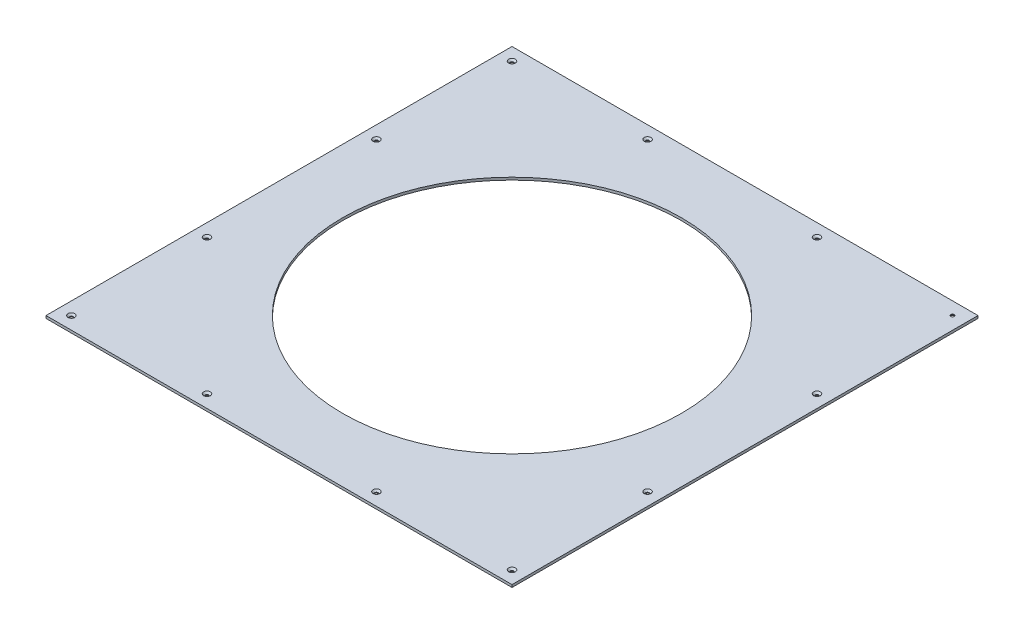
ISO-10303-21;
HEADER;
FILE_DESCRIPTION(('STEP AP214'),'2;1');
FILE_NAME('part.step','',(''),(''),'','','');
FILE_SCHEMA(('AUTOMOTIVE_DESIGN { 1 0 10303 214 1 1 1 1 }'));
ENDSEC;
DATA;
#1=APPLICATION_CONTEXT('core data for automotive mechanical design processes');
#2=APPLICATION_PROTOCOL_DEFINITION('international standard','automotive_design',2000,#1);
#3=PRODUCT_CONTEXT('',#1,'mechanical');
#4=PRODUCT('Part','Part','',(#3));
#5=PRODUCT_RELATED_PRODUCT_CATEGORY('part','',(#4));
#6=PRODUCT_DEFINITION_FORMATION('','',#4);
#7=PRODUCT_DEFINITION_CONTEXT('part definition',#1,'design');
#8=PRODUCT_DEFINITION('design','',#6,#7);
#9=PRODUCT_DEFINITION_SHAPE('','',#8);
#10=(LENGTH_UNIT() NAMED_UNIT(*) SI_UNIT(.MILLI.,.METRE.));
#11=(NAMED_UNIT(*) PLANE_ANGLE_UNIT() SI_UNIT($,.RADIAN.));
#12=(NAMED_UNIT(*) SI_UNIT($,.STERADIAN.) SOLID_ANGLE_UNIT());
#13=UNCERTAINTY_MEASURE_WITH_UNIT(LENGTH_MEASURE(1.E-05),#10,'distance_accuracy_value','');
#14=(GEOMETRIC_REPRESENTATION_CONTEXT(3) GLOBAL_UNCERTAINTY_ASSIGNED_CONTEXT((#13)) GLOBAL_UNIT_ASSIGNED_CONTEXT((#10,
#11,#12)) REPRESENTATION_CONTEXT('',''));
#15=CARTESIAN_POINT('',(0.,0.,0.));
#16=DIRECTION('',(0.,0.,1.));
#17=DIRECTION('',(1.,0.,0.));
#18=AXIS2_PLACEMENT_3D('',#15,#16,#17);
#19=CARTESIAN_POINT('',(0.,3.,0.));
#20=DIRECTION('',(0.,1.,0.));
#21=DIRECTION('',(0.,0.,1.));
#22=AXIS2_PLACEMENT_3D('',#19,#20,#21);
#23=PLANE('',#22);
#24=CARTESIAN_POINT('',(-260.000000000009,3.,-99.9999999999913));
#25=DIRECTION('',(0.,1.,0.));
#26=DIRECTION('',(0.,0.,1.));
#27=AXIS2_PLACEMENT_3D('',#24,#25,#26);
#28=CIRCLE('',#27,4.);
#29=CARTESIAN_POINT('',(-260.000000000009,3.,-95.9999999999913));
#30=VERTEX_POINT('',#29);
#31=EDGE_CURVE('E148',#30,#30,#28,.F.);
#32=ORIENTED_EDGE('',*,*,#31,.T.);
#33=EDGE_LOOP('',(#32));
#34=FACE_BOUND('',#33,.T.);
#35=CARTESIAN_POINT('',(-260.000000000009,3.,100.000000000009));
#36=DIRECTION('',(0.,1.,0.));
#37=DIRECTION('',(0.,0.,1.));
#38=AXIS2_PLACEMENT_3D('',#35,#36,#37);
#39=CIRCLE('',#38,4.);
#40=CARTESIAN_POINT('',(-260.000000000009,3.,104.000000000009));
#41=VERTEX_POINT('',#40);
#42=EDGE_CURVE('E145',#41,#41,#39,.F.);
#43=ORIENTED_EDGE('',*,*,#42,.T.);
#44=EDGE_LOOP('',(#43));
#45=FACE_BOUND('',#44,.T.);
#46=CARTESIAN_POINT('',(-260.000000000009,3.,260.000000000009));
#47=DIRECTION('',(0.,1.,0.));
#48=DIRECTION('',(0.,0.,1.));
#49=AXIS2_PLACEMENT_3D('',#46,#47,#48);
#50=CIRCLE('',#49,4.);
#51=CARTESIAN_POINT('',(-260.000000000009,3.,264.000000000009));
#52=VERTEX_POINT('',#51);
#53=EDGE_CURVE('E142',#52,#52,#50,.F.);
#54=ORIENTED_EDGE('',*,*,#53,.T.);
#55=EDGE_LOOP('',(#54));
#56=FACE_BOUND('',#55,.T.);
#57=CARTESIAN_POINT('',(-99.9999999999999,3.,260.000000000017));
#58=DIRECTION('',(0.,1.,0.));
#59=DIRECTION('',(0.,0.,1.));
#60=AXIS2_PLACEMENT_3D('',#57,#58,#59);
#61=CIRCLE('',#60,4.);
#62=CARTESIAN_POINT('',(-99.9999999999999,3.,264.000000000017));
#63=VERTEX_POINT('',#62);
#64=EDGE_CURVE('E139',#63,#63,#61,.F.);
#65=ORIENTED_EDGE('',*,*,#64,.T.);
#66=EDGE_LOOP('',(#65));
#67=FACE_BOUND('',#66,.T.);
#68=CARTESIAN_POINT('',(100.,3.,260.000000000017));
#69=DIRECTION('',(0.,1.,0.));
#70=DIRECTION('',(0.,0.,1.));
#71=AXIS2_PLACEMENT_3D('',#68,#69,#70);
#72=CIRCLE('',#71,4.);
#73=CARTESIAN_POINT('',(100.,3.,264.000000000017));
#74=VERTEX_POINT('',#73);
#75=EDGE_CURVE('E136',#74,#74,#72,.F.);
#76=ORIENTED_EDGE('',*,*,#75,.T.);
#77=EDGE_LOOP('',(#76));
#78=FACE_BOUND('',#77,.T.);
#79=CARTESIAN_POINT('',(260.,3.,260.000000000017));
#80=DIRECTION('',(0.,1.,0.));
#81=DIRECTION('',(0.,0.,1.));
#82=AXIS2_PLACEMENT_3D('',#79,#80,#81);
#83=CIRCLE('',#82,4.);
#84=CARTESIAN_POINT('',(260.,3.,264.000000000017));
#85=VERTEX_POINT('',#84);
#86=EDGE_CURVE('E133',#85,#85,#83,.F.);
#87=ORIENTED_EDGE('',*,*,#86,.T.);
#88=EDGE_LOOP('',(#87));
#89=FACE_BOUND('',#88,.T.);
#90=CARTESIAN_POINT('',(260.000000000009,3.,100.000000000009));
#91=DIRECTION('',(0.,1.,0.));
#92=DIRECTION('',(0.,0.,1.));
#93=AXIS2_PLACEMENT_3D('',#90,#91,#92);
#94=CIRCLE('',#93,4.);
#95=CARTESIAN_POINT('',(260.000000000009,3.,104.000000000009));
#96=VERTEX_POINT('',#95);
#97=EDGE_CURVE('E130',#96,#96,#94,.F.);
#98=ORIENTED_EDGE('',*,*,#97,.T.);
#99=EDGE_LOOP('',(#98));
#100=FACE_BOUND('',#99,.T.);
#101=CARTESIAN_POINT('',(260.000000000009,3.,-99.9999999999914));
#102=DIRECTION('',(0.,1.,0.));
#103=DIRECTION('',(0.,0.,1.));
#104=AXIS2_PLACEMENT_3D('',#101,#102,#103);
#105=CIRCLE('',#104,4.);
#106=CARTESIAN_POINT('',(260.000000000009,3.,-95.9999999999914));
#107=VERTEX_POINT('',#106);
#108=EDGE_CURVE('E127',#107,#107,#105,.F.);
#109=ORIENTED_EDGE('',*,*,#108,.T.);
#110=EDGE_LOOP('',(#109));
#111=FACE_BOUND('',#110,.T.);
#112=CARTESIAN_POINT('',(100.,3.,-260.));
#113=DIRECTION('',(0.,1.,0.));
#114=DIRECTION('',(0.,0.,1.));
#115=AXIS2_PLACEMENT_3D('',#112,#113,#114);
#116=CIRCLE('',#115,4.);
#117=CARTESIAN_POINT('',(100.,3.,-256.));
#118=VERTEX_POINT('',#117);
#119=EDGE_CURVE('E124',#118,#118,#116,.F.);
#120=ORIENTED_EDGE('',*,*,#119,.T.);
#121=EDGE_LOOP('',(#120));
#122=FACE_BOUND('',#121,.T.);
#123=CARTESIAN_POINT('',(-100.,3.,-260.));
#124=DIRECTION('',(0.,1.,0.));
#125=DIRECTION('',(0.,0.,1.));
#126=AXIS2_PLACEMENT_3D('',#123,#124,#125);
#127=CIRCLE('',#126,4.);
#128=CARTESIAN_POINT('',(-100.,3.,-256.));
#129=VERTEX_POINT('',#128);
#130=EDGE_CURVE('E121',#129,#129,#127,.F.);
#131=ORIENTED_EDGE('',*,*,#130,.T.);
#132=EDGE_LOOP('',(#131));
#133=FACE_BOUND('',#132,.T.);
#134=CARTESIAN_POINT('',(-260.,3.,-260.));
#135=DIRECTION('',(0.,1.,0.));
#136=DIRECTION('',(0.,0.,1.));
#137=AXIS2_PLACEMENT_3D('',#134,#135,#136);
#138=CIRCLE('',#137,4.);
#139=CARTESIAN_POINT('',(-260.,3.,-256.));
#140=VERTEX_POINT('',#139);
#141=EDGE_CURVE('E118',#140,#140,#138,.F.);
#142=ORIENTED_EDGE('',*,*,#141,.T.);
#143=EDGE_LOOP('',(#142));
#144=FACE_BOUND('',#143,.T.);
#145=CARTESIAN_POINT('',(260.000000000009,3.,-259.999999999991));
#146=DIRECTION('',(0.,1.,0.));
#147=DIRECTION('',(0.,0.,1.));
#148=AXIS2_PLACEMENT_3D('',#145,#146,#147);
#149=CIRCLE('',#148,2.);
#150=CARTESIAN_POINT('',(260.000000000009,3.,-257.999999999991));
#151=VERTEX_POINT('',#150);
#152=EDGE_CURVE('E363',#151,#151,#149,.T.);
#153=ORIENTED_EDGE('',*,*,#152,.F.);
#154=EDGE_LOOP('',(#153));
#155=FACE_BOUND('',#154,.T.);
#156=DIRECTION('',(0.,0.,1.));
#157=VECTOR('',#156,1.);
#158=CARTESIAN_POINT('',(-275.,3.,-275.));
#159=LINE('',#158,#157);
#160=CARTESIAN_POINT('',(-275.,3.,-275.));
#161=VERTEX_POINT('',#160);
#162=CARTESIAN_POINT('',(-275.,3.,275.));
#163=VERTEX_POINT('',#162);
#164=EDGE_CURVE('E90',#161,#163,#159,.T.);
#165=ORIENTED_EDGE('',*,*,#164,.T.);
#166=DIRECTION('',(1.,0.,0.));
#167=VECTOR('',#166,1.);
#168=CARTESIAN_POINT('',(-275.,3.,275.));
#169=LINE('',#168,#167);
#170=CARTESIAN_POINT('',(275.,3.,275.));
#171=VERTEX_POINT('',#170);
#172=EDGE_CURVE('E85',#163,#171,#169,.T.);
#173=ORIENTED_EDGE('',*,*,#172,.T.);
#174=DIRECTION('',(0.,0.,-1.));
#175=VECTOR('',#174,1.);
#176=CARTESIAN_POINT('',(275.,3.,-275.));
#177=LINE('',#176,#175);
#178=CARTESIAN_POINT('',(275.,3.,-275.));
#179=VERTEX_POINT('',#178);
#180=EDGE_CURVE('E88',#171,#179,#177,.T.);
#181=ORIENTED_EDGE('',*,*,#180,.T.);
#182=DIRECTION('',(-1.,0.,0.));
#183=VECTOR('',#182,1.);
#184=CARTESIAN_POINT('',(-275.,3.,-275.));
#185=LINE('',#184,#183);
#186=EDGE_CURVE('E54',#179,#161,#185,.T.);
#187=ORIENTED_EDGE('',*,*,#186,.T.);
#188=EDGE_LOOP('',(#165,#173,#181,#187));
#189=FACE_BOUND('',#188,.T.);
#190=CARTESIAN_POINT('',(0.,3.,0.));
#191=DIRECTION('',(0.,1.,0.));
#192=DIRECTION('',(0.,0.,1.));
#193=AXIS2_PLACEMENT_3D('',#190,#191,#192);
#194=CIRCLE('',#193,200.);
#195=CARTESIAN_POINT('',(0.,3.,200.));
#196=VERTEX_POINT('',#195);
#197=EDGE_CURVE('E108',#196,#196,#194,.T.);
#198=ORIENTED_EDGE('',*,*,#197,.F.);
#199=EDGE_LOOP('',(#198));
#200=FACE_BOUND('',#199,.T.);
#201=ADVANCED_FACE('F36',(#34,#45,#56,#67,#78,#89,#100,#111,#122,#133,#144,#155,#189,#200),#23,.T.);
#202=CARTESIAN_POINT('',(0.,0.,0.));
#203=DIRECTION('',(0.,1.,0.));
#204=DIRECTION('',(0.,0.,1.));
#205=AXIS2_PLACEMENT_3D('',#202,#203,#204);
#206=PLANE('',#205);
#207=CARTESIAN_POINT('',(260.000000000009,0.,-259.999999999991));
#208=DIRECTION('',(0.,1.,0.));
#209=DIRECTION('',(0.,0.,1.));
#210=AXIS2_PLACEMENT_3D('',#207,#208,#209);
#211=CIRCLE('',#210,3.99999999999989);
#212=CARTESIAN_POINT('',(260.000000000009,0.,-255.999999999992));
#213=VERTEX_POINT('',#212);
#214=EDGE_CURVE('E172',#213,#213,#211,.T.);
#215=ORIENTED_EDGE('',*,*,#214,.T.);
#216=EDGE_LOOP('',(#215));
#217=FACE_BOUND('',#216,.T.);
#218=CARTESIAN_POINT('',(-260.000000000009,0.,-99.9999999999913));
#219=DIRECTION('',(0.,1.,0.));
#220=DIRECTION('',(0.,0.,-1.));
#221=AXIS2_PLACEMENT_3D('',#218,#219,#220);
#222=CIRCLE('',#221,2.);
#223=CARTESIAN_POINT('',(-260.000000000009,0.,-101.999999999991));
#224=VERTEX_POINT('',#223);
#225=EDGE_CURVE('E303',#224,#224,#222,.T.);
#226=ORIENTED_EDGE('',*,*,#225,.T.);
#227=EDGE_LOOP('',(#226));
#228=FACE_BOUND('',#227,.T.);
#229=CARTESIAN_POINT('',(-260.000000000009,0.,100.000000000009));
#230=DIRECTION('',(0.,1.,0.));
#231=DIRECTION('',(0.,0.,1.));
#232=AXIS2_PLACEMENT_3D('',#229,#230,#231);
#233=CIRCLE('',#232,2.);
#234=CARTESIAN_POINT('',(-260.000000000009,0.,102.000000000009));
#235=VERTEX_POINT('',#234);
#236=EDGE_CURVE('E307',#235,#235,#233,.T.);
#237=ORIENTED_EDGE('',*,*,#236,.T.);
#238=EDGE_LOOP('',(#237));
#239=FACE_BOUND('',#238,.T.);
#240=CARTESIAN_POINT('',(-260.000000000009,0.,260.000000000009));
#241=DIRECTION('',(0.,1.,0.));
#242=DIRECTION('',(0.,0.,1.));
#243=AXIS2_PLACEMENT_3D('',#240,#241,#242);
#244=CIRCLE('',#243,2.);
#245=CARTESIAN_POINT('',(-260.000000000009,0.,262.000000000009));
#246=VERTEX_POINT('',#245);
#247=EDGE_CURVE('E311',#246,#246,#244,.T.);
#248=ORIENTED_EDGE('',*,*,#247,.T.);
#249=EDGE_LOOP('',(#248));
#250=FACE_BOUND('',#249,.T.);
#251=CARTESIAN_POINT('',(-99.9999999999999,0.,260.000000000017));
#252=DIRECTION('',(0.,1.,0.));
#253=DIRECTION('',(0.,0.,-1.));
#254=AXIS2_PLACEMENT_3D('',#251,#252,#253);
#255=CIRCLE('',#254,2.);
#256=CARTESIAN_POINT('',(-99.9999999999999,0.,258.000000000017));
#257=VERTEX_POINT('',#256);
#258=EDGE_CURVE('E315',#257,#257,#255,.T.);
#259=ORIENTED_EDGE('',*,*,#258,.T.);
#260=EDGE_LOOP('',(#259));
#261=FACE_BOUND('',#260,.T.);
#262=CARTESIAN_POINT('',(100.,0.,260.000000000017));
#263=DIRECTION('',(0.,1.,0.));
#264=DIRECTION('',(0.,0.,1.));
#265=AXIS2_PLACEMENT_3D('',#262,#263,#264);
#266=CIRCLE('',#265,2.);
#267=CARTESIAN_POINT('',(100.,0.,262.000000000017));
#268=VERTEX_POINT('',#267);
#269=EDGE_CURVE('E319',#268,#268,#266,.T.);
#270=ORIENTED_EDGE('',*,*,#269,.T.);
#271=EDGE_LOOP('',(#270));
#272=FACE_BOUND('',#271,.T.);
#273=CARTESIAN_POINT('',(260.,0.,260.000000000017));
#274=DIRECTION('',(0.,1.,0.));
#275=DIRECTION('',(0.,0.,1.));
#276=AXIS2_PLACEMENT_3D('',#273,#274,#275);
#277=CIRCLE('',#276,2.);
#278=CARTESIAN_POINT('',(260.,0.,262.000000000017));
#279=VERTEX_POINT('',#278);
#280=EDGE_CURVE('E323',#279,#279,#277,.T.);
#281=ORIENTED_EDGE('',*,*,#280,.T.);
#282=EDGE_LOOP('',(#281));
#283=FACE_BOUND('',#282,.T.);
#284=CARTESIAN_POINT('',(260.000000000009,0.,100.000000000009));
#285=DIRECTION('',(0.,1.,0.));
#286=DIRECTION('',(0.,0.,-1.));
#287=AXIS2_PLACEMENT_3D('',#284,#285,#286);
#288=CIRCLE('',#287,2.);
#289=CARTESIAN_POINT('',(260.000000000009,0.,98.0000000000086));
#290=VERTEX_POINT('',#289);
#291=EDGE_CURVE('E327',#290,#290,#288,.T.);
#292=ORIENTED_EDGE('',*,*,#291,.T.);
#293=EDGE_LOOP('',(#292));
#294=FACE_BOUND('',#293,.T.);
#295=CARTESIAN_POINT('',(260.000000000009,0.,-99.9999999999914));
#296=DIRECTION('',(0.,1.,0.));
#297=DIRECTION('',(0.,0.,1.));
#298=AXIS2_PLACEMENT_3D('',#295,#296,#297);
#299=CIRCLE('',#298,2.);
#300=CARTESIAN_POINT('',(260.000000000009,0.,-97.9999999999914));
#301=VERTEX_POINT('',#300);
#302=EDGE_CURVE('E331',#301,#301,#299,.T.);
#303=ORIENTED_EDGE('',*,*,#302,.T.);
#304=EDGE_LOOP('',(#303));
#305=FACE_BOUND('',#304,.T.);
#306=CARTESIAN_POINT('',(100.,0.,-260.));
#307=DIRECTION('',(0.,1.,0.));
#308=DIRECTION('',(0.,0.,-1.));
#309=AXIS2_PLACEMENT_3D('',#306,#307,#308);
#310=CIRCLE('',#309,2.);
#311=CARTESIAN_POINT('',(100.,0.,-262.));
#312=VERTEX_POINT('',#311);
#313=EDGE_CURVE('E335',#312,#312,#310,.T.);
#314=ORIENTED_EDGE('',*,*,#313,.T.);
#315=EDGE_LOOP('',(#314));
#316=FACE_BOUND('',#315,.T.);
#317=CARTESIAN_POINT('',(-100.,0.,-260.));
#318=DIRECTION('',(0.,1.,0.));
#319=DIRECTION('',(0.,0.,1.));
#320=AXIS2_PLACEMENT_3D('',#317,#318,#319);
#321=CIRCLE('',#320,2.);
#322=CARTESIAN_POINT('',(-100.,0.,-258.));
#323=VERTEX_POINT('',#322);
#324=EDGE_CURVE('E339',#323,#323,#321,.T.);
#325=ORIENTED_EDGE('',*,*,#324,.T.);
#326=EDGE_LOOP('',(#325));
#327=FACE_BOUND('',#326,.T.);
#328=CARTESIAN_POINT('',(-260.,0.,-260.));
#329=DIRECTION('',(0.,1.,0.));
#330=DIRECTION('',(0.,0.,1.));
#331=AXIS2_PLACEMENT_3D('',#328,#329,#330);
#332=CIRCLE('',#331,2.);
#333=CARTESIAN_POINT('',(-260.,0.,-258.));
#334=VERTEX_POINT('',#333);
#335=EDGE_CURVE('E343',#334,#334,#332,.T.);
#336=ORIENTED_EDGE('',*,*,#335,.T.);
#337=EDGE_LOOP('',(#336));
#338=FACE_BOUND('',#337,.T.);
#339=DIRECTION('',(0.,0.,1.));
#340=VECTOR('',#339,1.);
#341=CARTESIAN_POINT('',(-275.,0.,-275.));
#342=LINE('',#341,#340);
#343=CARTESIAN_POINT('',(-275.,0.,-275.));
#344=VERTEX_POINT('',#343);
#345=CARTESIAN_POINT('',(-275.,0.,275.));
#346=VERTEX_POINT('',#345);
#347=EDGE_CURVE('E105',#344,#346,#342,.T.);
#348=ORIENTED_EDGE('',*,*,#347,.F.);
#349=DIRECTION('',(-1.,0.,0.));
#350=VECTOR('',#349,1.);
#351=CARTESIAN_POINT('',(-275.,0.,-275.));
#352=LINE('',#351,#350);
#353=CARTESIAN_POINT('',(275.,0.,-275.));
#354=VERTEX_POINT('',#353);
#355=EDGE_CURVE('E77',#354,#344,#352,.T.);
#356=ORIENTED_EDGE('',*,*,#355,.F.);
#357=DIRECTION('',(0.,0.,-1.));
#358=VECTOR('',#357,1.);
#359=CARTESIAN_POINT('',(275.,0.,-275.));
#360=LINE('',#359,#358);
#361=CARTESIAN_POINT('',(275.,0.,275.));
#362=VERTEX_POINT('',#361);
#363=EDGE_CURVE('E71',#362,#354,#360,.T.);
#364=ORIENTED_EDGE('',*,*,#363,.F.);
#365=DIRECTION('',(1.,0.,0.));
#366=VECTOR('',#365,1.);
#367=CARTESIAN_POINT('',(-275.,0.,275.));
#368=LINE('',#367,#366);
#369=EDGE_CURVE('E95',#346,#362,#368,.T.);
#370=ORIENTED_EDGE('',*,*,#369,.F.);
#371=EDGE_LOOP('',(#348,#356,#364,#370));
#372=FACE_BOUND('',#371,.T.);
#373=CARTESIAN_POINT('',(0.,0.,0.));
#374=DIRECTION('',(0.,1.,0.));
#375=DIRECTION('',(0.,0.,1.));
#376=AXIS2_PLACEMENT_3D('',#373,#374,#375);
#377=CIRCLE('',#376,200.);
#378=CARTESIAN_POINT('',(0.,0.,200.));
#379=VERTEX_POINT('',#378);
#380=EDGE_CURVE('E348',#379,#379,#377,.T.);
#381=ORIENTED_EDGE('',*,*,#380,.T.);
#382=EDGE_LOOP('',(#381));
#383=FACE_BOUND('',#382,.T.);
#384=ADVANCED_FACE('F201',(#217,#228,#239,#250,#261,#272,#283,#294,#305,#316,#327,#338,#372,
#383),#206,.F.);
#385=CARTESIAN_POINT('',(-275.,3.,-275.));
#386=DIRECTION('',(1.,0.,0.));
#387=DIRECTION('',(0.,0.,-1.));
#388=AXIS2_PLACEMENT_3D('',#385,#386,#387);
#389=PLANE('',#388);
#390=ORIENTED_EDGE('',*,*,#347,.T.);
#391=DIRECTION('',(0.,-1.,0.));
#392=VECTOR('',#391,1.);
#393=CARTESIAN_POINT('',(-275.,3.,275.));
#394=LINE('',#393,#392);
#395=EDGE_CURVE('E96',#163,#346,#394,.T.);
#396=ORIENTED_EDGE('',*,*,#395,.F.);
#397=ORIENTED_EDGE('',*,*,#164,.F.);
#398=DIRECTION('',(0.,-1.,0.));
#399=VECTOR('',#398,1.);
#400=CARTESIAN_POINT('',(-275.,3.,-275.));
#401=LINE('',#400,#399);
#402=EDGE_CURVE('E101',#161,#344,#401,.T.);
#403=ORIENTED_EDGE('',*,*,#402,.T.);
#404=EDGE_LOOP('',(#390,#396,#397,#403));
#405=FACE_BOUND('',#404,.T.);
#406=ADVANCED_FACE('F207',(#405),#389,.F.);
#407=CARTESIAN_POINT('',(-275.,3.,275.));
#408=DIRECTION('',(0.,0.,-1.));
#409=DIRECTION('',(-1.,0.,0.));
#410=AXIS2_PLACEMENT_3D('',#407,#408,#409);
#411=PLANE('',#410);
#412=ORIENTED_EDGE('',*,*,#369,.T.);
#413=DIRECTION('',(0.,-1.,0.));
#414=VECTOR('',#413,1.);
#415=CARTESIAN_POINT('',(275.,3.,275.));
#416=LINE('',#415,#414);
#417=EDGE_CURVE('E93',#171,#362,#416,.T.);
#418=ORIENTED_EDGE('',*,*,#417,.F.);
#419=ORIENTED_EDGE('',*,*,#172,.F.);
#420=ORIENTED_EDGE('',*,*,#395,.T.);
#421=EDGE_LOOP('',(#412,#418,#419,#420));
#422=FACE_BOUND('',#421,.T.);
#423=ADVANCED_FACE('F94',(#422),#411,.F.);
#424=CARTESIAN_POINT('',(275.,3.,-275.));
#425=DIRECTION('',(-1.,0.,0.));
#426=DIRECTION('',(0.,0.,1.));
#427=AXIS2_PLACEMENT_3D('',#424,#425,#426);
#428=PLANE('',#427);
#429=ORIENTED_EDGE('',*,*,#363,.T.);
#430=DIRECTION('',(0.,-1.,0.));
#431=VECTOR('',#430,1.);
#432=CARTESIAN_POINT('',(275.,3.,-275.));
#433=LINE('',#432,#431);
#434=EDGE_CURVE('E97',#179,#354,#433,.T.);
#435=ORIENTED_EDGE('',*,*,#434,.F.);
#436=ORIENTED_EDGE('',*,*,#180,.F.);
#437=ORIENTED_EDGE('',*,*,#417,.T.);
#438=EDGE_LOOP('',(#429,#435,#436,#437));
#439=FACE_BOUND('',#438,.T.);
#440=ADVANCED_FACE('F99',(#439),#428,.F.);
#441=CARTESIAN_POINT('',(-275.,3.,-275.));
#442=DIRECTION('',(0.,0.,1.));
#443=DIRECTION('',(1.,0.,0.));
#444=AXIS2_PLACEMENT_3D('',#441,#442,#443);
#445=PLANE('',#444);
#446=ORIENTED_EDGE('',*,*,#355,.T.);
#447=ORIENTED_EDGE('',*,*,#402,.F.);
#448=ORIENTED_EDGE('',*,*,#186,.F.);
#449=ORIENTED_EDGE('',*,*,#434,.T.);
#450=EDGE_LOOP('',(#446,#447,#448,#449));
#451=FACE_BOUND('',#450,.T.);
#452=ADVANCED_FACE('F215',(#451),#445,.F.);
#453=CARTESIAN_POINT('',(0.,3.,0.));
#454=DIRECTION('',(0.,-1.,0.));
#455=DIRECTION('',(0.,0.,-1.));
#456=AXIS2_PLACEMENT_3D('',#453,#454,#455);
#457=CYLINDRICAL_SURFACE('',#456,200.);
#458=ORIENTED_EDGE('',*,*,#197,.T.);
#459=EDGE_LOOP('',(#458));
#460=FACE_BOUND('',#459,.T.);
#461=ORIENTED_EDGE('',*,*,#380,.F.);
#462=EDGE_LOOP('',(#461));
#463=FACE_BOUND('',#462,.T.);
#464=ADVANCED_FACE('F212',(#460,#463),#457,.F.);
#465=CARTESIAN_POINT('',(-260.,3.,-260.));
#466=DIRECTION('',(0.,-1.,0.));
#467=DIRECTION('',(0.,0.,-1.));
#468=AXIS2_PLACEMENT_3D('',#465,#466,#467);
#469=CYLINDRICAL_SURFACE('',#468,2.);
#470=CARTESIAN_POINT('',(-260.,0.999999999999986,-260.));
#471=DIRECTION('',(0.,1.,0.));
#472=DIRECTION('',(0.,0.,1.));
#473=AXIS2_PLACEMENT_3D('',#470,#471,#472);
#474=CIRCLE('',#473,2.);
#475=CARTESIAN_POINT('',(-260.,0.999999999999986,-258.));
#476=VERTEX_POINT('',#475);
#477=EDGE_CURVE('E11',#476,#476,#474,.T.);
#478=ORIENTED_EDGE('',*,*,#477,.T.);
#479=EDGE_LOOP('',(#478));
#480=FACE_BOUND('',#479,.T.);
#481=ORIENTED_EDGE('',*,*,#335,.F.);
#482=EDGE_LOOP('',(#481));
#483=FACE_BOUND('',#482,.T.);
#484=ADVANCED_FACE('F412',(#480,#483),#469,.F.);
#485=CARTESIAN_POINT('',(-100.,3.,-260.));
#486=DIRECTION('',(0.,-1.,0.));
#487=DIRECTION('',(0.,0.,-1.));
#488=AXIS2_PLACEMENT_3D('',#485,#486,#487);
#489=CYLINDRICAL_SURFACE('',#488,2.);
#490=CARTESIAN_POINT('',(-100.,0.999999999999986,-260.));
#491=DIRECTION('',(0.,1.,0.));
#492=DIRECTION('',(0.,0.,1.));
#493=AXIS2_PLACEMENT_3D('',#490,#491,#492);
#494=CIRCLE('',#493,2.);
#495=CARTESIAN_POINT('',(-100.,0.999999999999986,-258.));
#496=VERTEX_POINT('',#495);
#497=EDGE_CURVE('E46',#496,#496,#494,.T.);
#498=ORIENTED_EDGE('',*,*,#497,.T.);
#499=EDGE_LOOP('',(#498));
#500=FACE_BOUND('',#499,.T.);
#501=ORIENTED_EDGE('',*,*,#324,.F.);
#502=EDGE_LOOP('',(#501));
#503=FACE_BOUND('',#502,.T.);
#504=ADVANCED_FACE('F183',(#500,#503),#489,.F.);
#505=CARTESIAN_POINT('',(100.,3.,-260.));
#506=DIRECTION('',(0.,-1.,0.));
#507=DIRECTION('',(0.,0.,-1.));
#508=AXIS2_PLACEMENT_3D('',#505,#506,#507);
#509=CYLINDRICAL_SURFACE('',#508,2.);
#510=CARTESIAN_POINT('',(100.,0.999999999999986,-260.));
#511=DIRECTION('',(0.,1.,0.));
#512=DIRECTION('',(0.,0.,1.));
#513=AXIS2_PLACEMENT_3D('',#510,#511,#512);
#514=CIRCLE('',#513,2.);
#515=CARTESIAN_POINT('',(100.,0.999999999999986,-258.));
#516=VERTEX_POINT('',#515);
#517=EDGE_CURVE('E178',#516,#516,#514,.T.);
#518=ORIENTED_EDGE('',*,*,#517,.T.);
#519=EDGE_LOOP('',(#518));
#520=FACE_BOUND('',#519,.T.);
#521=ORIENTED_EDGE('',*,*,#313,.F.);
#522=EDGE_LOOP('',(#521));
#523=FACE_BOUND('',#522,.T.);
#524=ADVANCED_FACE('F373',(#520,#523),#509,.F.);
#525=CARTESIAN_POINT('',(260.000000000009,3.,-259.999999999991));
#526=DIRECTION('',(0.,-1.,0.));
#527=DIRECTION('',(0.,0.,-1.));
#528=AXIS2_PLACEMENT_3D('',#525,#526,#527);
#529=CYLINDRICAL_SURFACE('',#528,2.);
#530=CARTESIAN_POINT('',(260.000000000009,1.9999999999999,-259.999999999991));
#531=DIRECTION('',(0.,1.,0.));
#532=DIRECTION('',(0.,0.,1.));
#533=AXIS2_PLACEMENT_3D('',#530,#531,#532);
#534=CIRCLE('',#533,2.);
#535=CARTESIAN_POINT('',(260.000000000009,1.9999999999999,-257.999999999991));
#536=VERTEX_POINT('',#535);
#537=EDGE_CURVE('E175',#536,#536,#534,.F.);
#538=ORIENTED_EDGE('',*,*,#537,.T.);
#539=EDGE_LOOP('',(#538));
#540=FACE_BOUND('',#539,.T.);
#541=ORIENTED_EDGE('',*,*,#152,.T.);
#542=EDGE_LOOP('',(#541));
#543=FACE_BOUND('',#542,.T.);
#544=ADVANCED_FACE('F369',(#540,#543),#529,.F.);
#545=CARTESIAN_POINT('',(260.000000000009,3.,-99.9999999999914));
#546=DIRECTION('',(0.,-1.,0.));
#547=DIRECTION('',(0.,0.,-1.));
#548=AXIS2_PLACEMENT_3D('',#545,#546,#547);
#549=CYLINDRICAL_SURFACE('',#548,2.);
#550=CARTESIAN_POINT('',(260.000000000009,0.999999999999986,-99.9999999999914));
#551=DIRECTION('',(0.,1.,0.));
#552=DIRECTION('',(0.,0.,1.));
#553=AXIS2_PLACEMENT_3D('',#550,#551,#552);
#554=CIRCLE('',#553,2.);
#555=CARTESIAN_POINT('',(260.000000000009,0.999999999999986,-97.9999999999914));
#556=VERTEX_POINT('',#555);
#557=EDGE_CURVE('E169',#556,#556,#554,.T.);
#558=ORIENTED_EDGE('',*,*,#557,.T.);
#559=EDGE_LOOP('',(#558));
#560=FACE_BOUND('',#559,.T.);
#561=ORIENTED_EDGE('',*,*,#302,.F.);
#562=EDGE_LOOP('',(#561));
#563=FACE_BOUND('',#562,.T.);
#564=ADVANCED_FACE('F372',(#560,#563),#549,.F.);
#565=CARTESIAN_POINT('',(260.000000000009,3.,100.000000000009));
#566=DIRECTION('',(0.,-1.,0.));
#567=DIRECTION('',(0.,0.,-1.));
#568=AXIS2_PLACEMENT_3D('',#565,#566,#567);
#569=CYLINDRICAL_SURFACE('',#568,2.);
#570=CARTESIAN_POINT('',(260.000000000009,0.999999999999986,100.000000000009));
#571=DIRECTION('',(0.,1.,0.));
#572=DIRECTION('',(0.,0.,1.));
#573=AXIS2_PLACEMENT_3D('',#570,#571,#572);
#574=CIRCLE('',#573,2.);
#575=CARTESIAN_POINT('',(260.000000000009,0.999999999999986,102.000000000009));
#576=VERTEX_POINT('',#575);
#577=EDGE_CURVE('E166',#576,#576,#574,.T.);
#578=ORIENTED_EDGE('',*,*,#577,.T.);
#579=EDGE_LOOP('',(#578));
#580=FACE_BOUND('',#579,.T.);
#581=ORIENTED_EDGE('',*,*,#291,.F.);
#582=EDGE_LOOP('',(#581));
#583=FACE_BOUND('',#582,.T.);
#584=ADVANCED_FACE('F380',(#580,#583),#569,.F.);
#585=CARTESIAN_POINT('',(260.,3.,260.000000000017));
#586=DIRECTION('',(0.,-1.,0.));
#587=DIRECTION('',(0.,0.,-1.));
#588=AXIS2_PLACEMENT_3D('',#585,#586,#587);
#589=CYLINDRICAL_SURFACE('',#588,2.);
#590=CARTESIAN_POINT('',(260.,0.999999999999986,260.000000000017));
#591=DIRECTION('',(0.,1.,0.));
#592=DIRECTION('',(0.,0.,1.));
#593=AXIS2_PLACEMENT_3D('',#590,#591,#592);
#594=CIRCLE('',#593,2.);
#595=CARTESIAN_POINT('',(260.,0.999999999999986,262.000000000017));
#596=VERTEX_POINT('',#595);
#597=EDGE_CURVE('E163',#596,#596,#594,.T.);
#598=ORIENTED_EDGE('',*,*,#597,.T.);
#599=EDGE_LOOP('',(#598));
#600=FACE_BOUND('',#599,.T.);
#601=ORIENTED_EDGE('',*,*,#280,.F.);
#602=EDGE_LOOP('',(#601));
#603=FACE_BOUND('',#602,.T.);
#604=ADVANCED_FACE('F389',(#600,#603),#589,.F.);
#605=CARTESIAN_POINT('',(100.,3.,260.000000000017));
#606=DIRECTION('',(0.,-1.,0.));
#607=DIRECTION('',(0.,0.,-1.));
#608=AXIS2_PLACEMENT_3D('',#605,#606,#607);
#609=CYLINDRICAL_SURFACE('',#608,2.);
#610=CARTESIAN_POINT('',(100.,0.999999999999986,260.000000000017));
#611=DIRECTION('',(0.,1.,0.));
#612=DIRECTION('',(0.,0.,1.));
#613=AXIS2_PLACEMENT_3D('',#610,#611,#612);
#614=CIRCLE('',#613,2.);
#615=CARTESIAN_POINT('',(100.,0.999999999999986,262.000000000017));
#616=VERTEX_POINT('',#615);
#617=EDGE_CURVE('E160',#616,#616,#614,.T.);
#618=ORIENTED_EDGE('',*,*,#617,.T.);
#619=EDGE_LOOP('',(#618));
#620=FACE_BOUND('',#619,.T.);
#621=ORIENTED_EDGE('',*,*,#269,.F.);
#622=EDGE_LOOP('',(#621));
#623=FACE_BOUND('',#622,.T.);
#624=ADVANCED_FACE('F393',(#620,#623),#609,.F.);
#625=CARTESIAN_POINT('',(-99.9999999999999,3.,260.000000000017));
#626=DIRECTION('',(0.,-1.,0.));
#627=DIRECTION('',(0.,0.,-1.));
#628=AXIS2_PLACEMENT_3D('',#625,#626,#627);
#629=CYLINDRICAL_SURFACE('',#628,2.);
#630=CARTESIAN_POINT('',(-99.9999999999999,0.999999999999986,260.000000000017));
#631=DIRECTION('',(0.,1.,0.));
#632=DIRECTION('',(0.,0.,1.));
#633=AXIS2_PLACEMENT_3D('',#630,#631,#632);
#634=CIRCLE('',#633,2.);
#635=CARTESIAN_POINT('',(-99.9999999999999,0.999999999999986,262.000000000017));
#636=VERTEX_POINT('',#635);
#637=EDGE_CURVE('E157',#636,#636,#634,.T.);
#638=ORIENTED_EDGE('',*,*,#637,.T.);
#639=EDGE_LOOP('',(#638));
#640=FACE_BOUND('',#639,.T.);
#641=ORIENTED_EDGE('',*,*,#258,.F.);
#642=EDGE_LOOP('',(#641));
#643=FACE_BOUND('',#642,.T.);
#644=ADVANCED_FACE('F397',(#640,#643),#629,.F.);
#645=CARTESIAN_POINT('',(-260.000000000009,3.,260.000000000009));
#646=DIRECTION('',(0.,-1.,0.));
#647=DIRECTION('',(0.,0.,-1.));
#648=AXIS2_PLACEMENT_3D('',#645,#646,#647);
#649=CYLINDRICAL_SURFACE('',#648,2.);
#650=CARTESIAN_POINT('',(-260.000000000009,0.999999999999986,260.000000000009));
#651=DIRECTION('',(0.,1.,0.));
#652=DIRECTION('',(0.,0.,1.));
#653=AXIS2_PLACEMENT_3D('',#650,#651,#652);
#654=CIRCLE('',#653,2.);
#655=CARTESIAN_POINT('',(-260.000000000009,0.999999999999986,262.000000000009));
#656=VERTEX_POINT('',#655);
#657=EDGE_CURVE('E154',#656,#656,#654,.T.);
#658=ORIENTED_EDGE('',*,*,#657,.T.);
#659=EDGE_LOOP('',(#658));
#660=FACE_BOUND('',#659,.T.);
#661=ORIENTED_EDGE('',*,*,#247,.F.);
#662=EDGE_LOOP('',(#661));
#663=FACE_BOUND('',#662,.T.);
#664=ADVANCED_FACE('F401',(#660,#663),#649,.F.);
#665=CARTESIAN_POINT('',(-260.000000000009,3.,100.000000000009));
#666=DIRECTION('',(0.,-1.,0.));
#667=DIRECTION('',(0.,0.,-1.));
#668=AXIS2_PLACEMENT_3D('',#665,#666,#667);
#669=CYLINDRICAL_SURFACE('',#668,2.);
#670=CARTESIAN_POINT('',(-260.000000000009,0.999999999999986,100.000000000009));
#671=DIRECTION('',(0.,1.,0.));
#672=DIRECTION('',(0.,0.,1.));
#673=AXIS2_PLACEMENT_3D('',#670,#671,#672);
#674=CIRCLE('',#673,2.);
#675=CARTESIAN_POINT('',(-260.000000000009,0.999999999999986,102.000000000009));
#676=VERTEX_POINT('',#675);
#677=EDGE_CURVE('E151',#676,#676,#674,.T.);
#678=ORIENTED_EDGE('',*,*,#677,.T.);
#679=EDGE_LOOP('',(#678));
#680=FACE_BOUND('',#679,.T.);
#681=ORIENTED_EDGE('',*,*,#236,.F.);
#682=EDGE_LOOP('',(#681));
#683=FACE_BOUND('',#682,.T.);
#684=ADVANCED_FACE('F405',(#680,#683),#669,.F.);
#685=CARTESIAN_POINT('',(-260.000000000009,3.,-99.9999999999913));
#686=DIRECTION('',(0.,-1.,0.));
#687=DIRECTION('',(0.,0.,-1.));
#688=AXIS2_PLACEMENT_3D('',#685,#686,#687);
#689=CYLINDRICAL_SURFACE('',#688,2.);
#690=CARTESIAN_POINT('',(-260.000000000009,0.999999999999986,-99.9999999999913));
#691=DIRECTION('',(0.,1.,0.));
#692=DIRECTION('',(0.,0.,1.));
#693=AXIS2_PLACEMENT_3D('',#690,#691,#692);
#694=CIRCLE('',#693,2.);
#695=CARTESIAN_POINT('',(-260.000000000009,0.999999999999986,-97.9999999999913));
#696=VERTEX_POINT('',#695);
#697=EDGE_CURVE('E115',#696,#696,#694,.T.);
#698=ORIENTED_EDGE('',*,*,#697,.T.);
#699=EDGE_LOOP('',(#698));
#700=FACE_BOUND('',#699,.T.);
#701=ORIENTED_EDGE('',*,*,#225,.F.);
#702=EDGE_LOOP('',(#701));
#703=FACE_BOUND('',#702,.T.);
#704=ADVANCED_FACE('F233',(#700,#703),#689,.F.);
#705=CARTESIAN_POINT('',(-260.000000000009,0.999999999999986,-99.9999999999913));
#706=DIRECTION('',(0.,1.,0.));
#707=DIRECTION('',(0.,0.,1.));
#708=AXIS2_PLACEMENT_3D('',#705,#706,#707);
#709=CONICAL_SURFACE('',#708,2.,0.785398163397447);
#710=ORIENTED_EDGE('',*,*,#31,.F.);
#711=EDGE_LOOP('',(#710));
#712=FACE_BOUND('',#711,.T.);
#713=ORIENTED_EDGE('',*,*,#697,.F.);
#714=EDGE_LOOP('',(#713));
#715=FACE_BOUND('',#714,.T.);
#716=ADVANCED_FACE('F226',(#712,#715),#709,.F.);
#717=CARTESIAN_POINT('',(-260.000000000009,0.999999999999986,100.000000000009));
#718=DIRECTION('',(0.,1.,0.));
#719=DIRECTION('',(0.,0.,1.));
#720=AXIS2_PLACEMENT_3D('',#717,#718,#719);
#721=CONICAL_SURFACE('',#720,2.,0.785398163397447);
#722=ORIENTED_EDGE('',*,*,#42,.F.);
#723=EDGE_LOOP('',(#722));
#724=FACE_BOUND('',#723,.T.);
#725=ORIENTED_EDGE('',*,*,#677,.F.);
#726=EDGE_LOOP('',(#725));
#727=FACE_BOUND('',#726,.T.);
#728=ADVANCED_FACE('F232',(#724,#727),#721,.F.);
#729=CARTESIAN_POINT('',(-260.000000000009,0.999999999999986,260.000000000009));
#730=DIRECTION('',(0.,1.,0.));
#731=DIRECTION('',(0.,0.,1.));
#732=AXIS2_PLACEMENT_3D('',#729,#730,#731);
#733=CONICAL_SURFACE('',#732,2.,0.785398163397447);
#734=ORIENTED_EDGE('',*,*,#53,.F.);
#735=EDGE_LOOP('',(#734));
#736=FACE_BOUND('',#735,.T.);
#737=ORIENTED_EDGE('',*,*,#657,.F.);
#738=EDGE_LOOP('',(#737));
#739=FACE_BOUND('',#738,.T.);
#740=ADVANCED_FACE('F240',(#736,#739),#733,.F.);
#741=CARTESIAN_POINT('',(-99.9999999999999,0.999999999999986,260.000000000017));
#742=DIRECTION('',(0.,1.,0.));
#743=DIRECTION('',(0.,0.,1.));
#744=AXIS2_PLACEMENT_3D('',#741,#742,#743);
#745=CONICAL_SURFACE('',#744,2.,0.785398163397447);
#746=ORIENTED_EDGE('',*,*,#64,.F.);
#747=EDGE_LOOP('',(#746));
#748=FACE_BOUND('',#747,.T.);
#749=ORIENTED_EDGE('',*,*,#637,.F.);
#750=EDGE_LOOP('',(#749));
#751=FACE_BOUND('',#750,.T.);
#752=ADVANCED_FACE('F247',(#748,#751),#745,.F.);
#753=CARTESIAN_POINT('',(100.,0.999999999999986,260.000000000017));
#754=DIRECTION('',(0.,1.,0.));
#755=DIRECTION('',(0.,0.,1.));
#756=AXIS2_PLACEMENT_3D('',#753,#754,#755);
#757=CONICAL_SURFACE('',#756,2.,0.785398163397447);
#758=ORIENTED_EDGE('',*,*,#75,.F.);
#759=EDGE_LOOP('',(#758));
#760=FACE_BOUND('',#759,.T.);
#761=ORIENTED_EDGE('',*,*,#617,.F.);
#762=EDGE_LOOP('',(#761));
#763=FACE_BOUND('',#762,.T.);
#764=ADVANCED_FACE('F254',(#760,#763),#757,.F.);
#765=CARTESIAN_POINT('',(260.,0.999999999999986,260.000000000017));
#766=DIRECTION('',(0.,1.,0.));
#767=DIRECTION('',(0.,0.,1.));
#768=AXIS2_PLACEMENT_3D('',#765,#766,#767);
#769=CONICAL_SURFACE('',#768,2.,0.785398163397447);
#770=ORIENTED_EDGE('',*,*,#86,.F.);
#771=EDGE_LOOP('',(#770));
#772=FACE_BOUND('',#771,.T.);
#773=ORIENTED_EDGE('',*,*,#597,.F.);
#774=EDGE_LOOP('',(#773));
#775=FACE_BOUND('',#774,.T.);
#776=ADVANCED_FACE('F261',(#772,#775),#769,.F.);
#777=CARTESIAN_POINT('',(260.000000000009,0.999999999999986,100.000000000009));
#778=DIRECTION('',(0.,1.,0.));
#779=DIRECTION('',(0.,0.,1.));
#780=AXIS2_PLACEMENT_3D('',#777,#778,#779);
#781=CONICAL_SURFACE('',#780,2.,0.785398163397447);
#782=ORIENTED_EDGE('',*,*,#97,.F.);
#783=EDGE_LOOP('',(#782));
#784=FACE_BOUND('',#783,.T.);
#785=ORIENTED_EDGE('',*,*,#577,.F.);
#786=EDGE_LOOP('',(#785));
#787=FACE_BOUND('',#786,.T.);
#788=ADVANCED_FACE('F268',(#784,#787),#781,.F.);
#789=CARTESIAN_POINT('',(260.000000000009,0.999999999999986,-99.9999999999914));
#790=DIRECTION('',(0.,1.,0.));
#791=DIRECTION('',(0.,0.,1.));
#792=AXIS2_PLACEMENT_3D('',#789,#790,#791);
#793=CONICAL_SURFACE('',#792,2.,0.785398163397447);
#794=ORIENTED_EDGE('',*,*,#108,.F.);
#795=EDGE_LOOP('',(#794));
#796=FACE_BOUND('',#795,.T.);
#797=ORIENTED_EDGE('',*,*,#557,.F.);
#798=EDGE_LOOP('',(#797));
#799=FACE_BOUND('',#798,.T.);
#800=ADVANCED_FACE('F275',(#796,#799),#793,.F.);
#801=CARTESIAN_POINT('',(260.000000000009,0.,-259.999999999991));
#802=DIRECTION('',(0.,-1.,0.));
#803=DIRECTION('',(0.,0.,-1.));
#804=AXIS2_PLACEMENT_3D('',#801,#802,#803);
#805=CONICAL_SURFACE('',#804,3.99999999999989,0.785398163397447);
#806=ORIENTED_EDGE('',*,*,#537,.F.);
#807=EDGE_LOOP('',(#806));
#808=FACE_BOUND('',#807,.T.);
#809=ORIENTED_EDGE('',*,*,#214,.F.);
#810=EDGE_LOOP('',(#809));
#811=FACE_BOUND('',#810,.T.);
#812=ADVANCED_FACE('F195',(#808,#811),#805,.F.);
#813=CARTESIAN_POINT('',(100.,0.999999999999986,-260.));
#814=DIRECTION('',(0.,1.,0.));
#815=DIRECTION('',(0.,0.,1.));
#816=AXIS2_PLACEMENT_3D('',#813,#814,#815);
#817=CONICAL_SURFACE('',#816,2.,0.785398163397447);
#818=ORIENTED_EDGE('',*,*,#119,.F.);
#819=EDGE_LOOP('',(#818));
#820=FACE_BOUND('',#819,.T.);
#821=ORIENTED_EDGE('',*,*,#517,.F.);
#822=EDGE_LOOP('',(#821));
#823=FACE_BOUND('',#822,.T.);
#824=ADVANCED_FACE('F188',(#820,#823),#817,.F.);
#825=CARTESIAN_POINT('',(-100.,0.999999999999986,-260.));
#826=DIRECTION('',(0.,1.,0.));
#827=DIRECTION('',(0.,0.,1.));
#828=AXIS2_PLACEMENT_3D('',#825,#826,#827);
#829=CONICAL_SURFACE('',#828,2.,0.785398163397447);
#830=ORIENTED_EDGE('',*,*,#130,.F.);
#831=EDGE_LOOP('',(#830));
#832=FACE_BOUND('',#831,.T.);
#833=ORIENTED_EDGE('',*,*,#497,.F.);
#834=EDGE_LOOP('',(#833));
#835=FACE_BOUND('',#834,.T.);
#836=ADVANCED_FACE('F186',(#832,#835),#829,.F.);
#837=CARTESIAN_POINT('',(-260.,0.999999999999986,-260.));
#838=DIRECTION('',(0.,1.,0.));
#839=DIRECTION('',(0.,0.,1.));
#840=AXIS2_PLACEMENT_3D('',#837,#838,#839);
#841=CONICAL_SURFACE('',#840,2.,0.785398163397447);
#842=ORIENTED_EDGE('',*,*,#141,.F.);
#843=EDGE_LOOP('',(#842));
#844=FACE_BOUND('',#843,.T.);
#845=ORIENTED_EDGE('',*,*,#477,.F.);
#846=EDGE_LOOP('',(#845));
#847=FACE_BOUND('',#846,.T.);
#848=ADVANCED_FACE('F39',(#844,#847),#841,.F.);
#849=CLOSED_SHELL('',(#201,#384,#406,#423,#440,#452,#464,#484,#504,#524,#544,#564,#584,#604,
#624,#644,#664,#684,#704,#716,#728,#740,#752,#764,#776,#788,#800,#812,#824,#836,#848));
#850=MANIFOLD_SOLID_BREP('B2',#849);
#851=ADVANCED_BREP_SHAPE_REPRESENTATION('',(#18,#850),#14);
#852=SHAPE_DEFINITION_REPRESENTATION(#9,#851);
ENDSEC;
END-ISO-10303-21;
